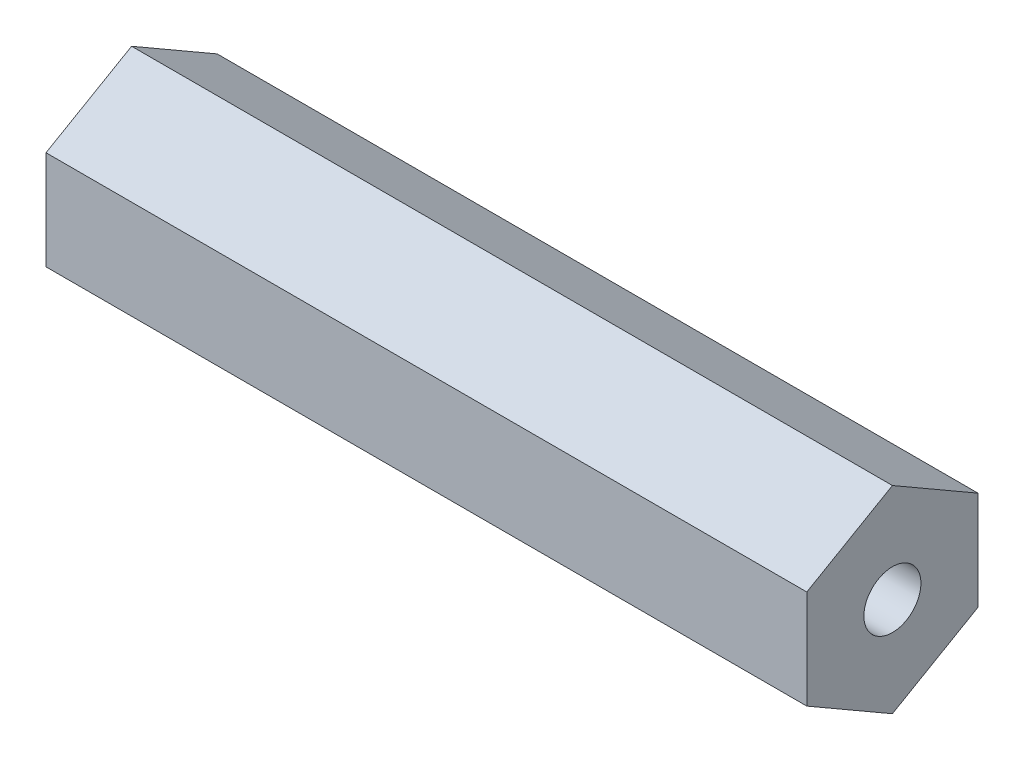
ISO-10303-21;
HEADER;
FILE_DESCRIPTION(('STEP AP214'),'2;1');
FILE_NAME('part.step','',(''),(''),'','','');
FILE_SCHEMA(('AUTOMOTIVE_DESIGN { 1 0 10303 214 1 1 1 1 }'));
ENDSEC;
DATA;
#1=APPLICATION_CONTEXT('core data for automotive mechanical design processes');
#2=APPLICATION_PROTOCOL_DEFINITION('international standard','automotive_design',2000,#1);
#3=PRODUCT_CONTEXT('',#1,'mechanical');
#4=PRODUCT('Part','Part','',(#3));
#5=PRODUCT_RELATED_PRODUCT_CATEGORY('part','',(#4));
#6=PRODUCT_DEFINITION_FORMATION('','',#4);
#7=PRODUCT_DEFINITION_CONTEXT('part definition',#1,'design');
#8=PRODUCT_DEFINITION('design','',#6,#7);
#9=PRODUCT_DEFINITION_SHAPE('','',#8);
#10=(LENGTH_UNIT() NAMED_UNIT(*) SI_UNIT(.MILLI.,.METRE.));
#11=(NAMED_UNIT(*) PLANE_ANGLE_UNIT() SI_UNIT($,.RADIAN.));
#12=(NAMED_UNIT(*) SI_UNIT($,.STERADIAN.) SOLID_ANGLE_UNIT());
#13=UNCERTAINTY_MEASURE_WITH_UNIT(LENGTH_MEASURE(1.E-05),#10,'distance_accuracy_value','');
#14=(GEOMETRIC_REPRESENTATION_CONTEXT(3) GLOBAL_UNCERTAINTY_ASSIGNED_CONTEXT((#13)) GLOBAL_UNIT_ASSIGNED_CONTEXT((#10,
#11,#12)) REPRESENTATION_CONTEXT('',''));
#15=CARTESIAN_POINT('',(0.,0.,0.));
#16=DIRECTION('',(0.,0.,1.));
#17=DIRECTION('',(1.,0.,0.));
#18=AXIS2_PLACEMENT_3D('',#15,#16,#17);
#19=CARTESIAN_POINT('',(-10.,32.,73.));
#20=DIRECTION('',(-1.,0.,0.));
#21=DIRECTION('',(0.,0.,1.));
#22=AXIS2_PLACEMENT_3D('',#19,#20,#21);
#23=CYLINDRICAL_SURFACE('',#22,0.749999999999987);
#24=CARTESIAN_POINT('',(10.,32.,73.));
#25=DIRECTION('',(-1.,0.,0.));
#26=DIRECTION('',(0.,0.,1.));
#27=AXIS2_PLACEMENT_3D('',#24,#25,#26);
#28=CIRCLE('',#27,0.749999999999985);
#29=CARTESIAN_POINT('',(10.,32.,73.75));
#30=VERTEX_POINT('',#29);
#31=EDGE_CURVE('E11',#30,#30,#28,.T.);
#32=ORIENTED_EDGE('',*,*,#31,.F.);
#33=EDGE_LOOP('',(#32));
#34=FACE_BOUND('',#33,.T.);
#35=CARTESIAN_POINT('',(-10.,32.,73.));
#36=DIRECTION('',(-1.,0.,0.));
#37=DIRECTION('',(0.,0.,1.));
#38=AXIS2_PLACEMENT_3D('',#35,#36,#37);
#39=CIRCLE('',#38,0.749999999999989);
#40=CARTESIAN_POINT('',(-10.,32.,73.75));
#41=VERTEX_POINT('',#40);
#42=EDGE_CURVE('E47',#41,#41,#39,.T.);
#43=ORIENTED_EDGE('',*,*,#42,.T.);
#44=EDGE_LOOP('',(#43));
#45=FACE_BOUND('',#44,.T.);
#46=ADVANCED_FACE('F36',(#34,#45),#23,.F.);
#47=CARTESIAN_POINT('',(10.,32.,73.));
#48=DIRECTION('',(-1.,0.,0.));
#49=DIRECTION('',(0.,0.,1.));
#50=AXIS2_PLACEMENT_3D('',#47,#48,#49);
#51=PLANE('',#50);
#52=ORIENTED_EDGE('',*,*,#31,.T.);
#53=EDGE_LOOP('',(#52));
#54=FACE_BOUND('',#53,.T.);
#55=DIRECTION('',(0.,-1.,0.));
#56=VECTOR('',#55,1.);
#57=CARTESIAN_POINT('',(10.,33.2990381056767,70.75));
#58=LINE('',#57,#56);
#59=CARTESIAN_POINT('',(10.,33.2990381056767,70.75));
#60=VERTEX_POINT('',#59);
#61=CARTESIAN_POINT('',(10.,30.7009618943233,70.75));
#62=VERTEX_POINT('',#61);
#63=EDGE_CURVE('E152',#60,#62,#58,.T.);
#64=ORIENTED_EDGE('',*,*,#63,.F.);
#65=DIRECTION('',(0.,-0.5,-0.866025403784439));
#66=VECTOR('',#65,1.);
#67=CARTESIAN_POINT('',(10.,34.5980762113533,73.));
#68=LINE('',#67,#66);
#69=CARTESIAN_POINT('',(10.,34.5980762113533,73.));
#70=VERTEX_POINT('',#69);
#71=EDGE_CURVE('E131',#70,#60,#68,.T.);
#72=ORIENTED_EDGE('',*,*,#71,.F.);
#73=DIRECTION('',(0.,0.5,-0.866025403784439));
#74=VECTOR('',#73,1.);
#75=CARTESIAN_POINT('',(10.,33.2990381056767,75.25));
#76=LINE('',#75,#74);
#77=CARTESIAN_POINT('',(10.,33.2990381056767,75.25));
#78=VERTEX_POINT('',#77);
#79=EDGE_CURVE('E167',#78,#70,#76,.T.);
#80=ORIENTED_EDGE('',*,*,#79,.F.);
#81=DIRECTION('',(0.,1.,0.));
#82=VECTOR('',#81,1.);
#83=CARTESIAN_POINT('',(10.,30.7009618943233,75.25));
#84=LINE('',#83,#82);
#85=CARTESIAN_POINT('',(10.,30.7009618943233,75.25));
#86=VERTEX_POINT('',#85);
#87=EDGE_CURVE('E110',#86,#78,#84,.T.);
#88=ORIENTED_EDGE('',*,*,#87,.F.);
#89=DIRECTION('',(0.,0.5,0.866025403784439));
#90=VECTOR('',#89,1.);
#91=CARTESIAN_POINT('',(10.,29.4019237886467,73.));
#92=LINE('',#91,#90);
#93=CARTESIAN_POINT('',(10.,29.4019237886467,73.));
#94=VERTEX_POINT('',#93);
#95=EDGE_CURVE('E162',#94,#86,#92,.T.);
#96=ORIENTED_EDGE('',*,*,#95,.F.);
#97=DIRECTION('',(0.,-0.5,0.866025403784439));
#98=VECTOR('',#97,1.);
#99=CARTESIAN_POINT('',(10.,30.7009618943233,70.75));
#100=LINE('',#99,#98);
#101=EDGE_CURVE('E141',#62,#94,#100,.T.);
#102=ORIENTED_EDGE('',*,*,#101,.F.);
#103=EDGE_LOOP('',(#64,#72,#80,#88,#96,#102));
#104=FACE_BOUND('',#103,.T.);
#105=ADVANCED_FACE('F207',(#54,#104),#51,.F.);
#106=CARTESIAN_POINT('',(-10.,32.,73.));
#107=DIRECTION('',(-1.,0.,0.));
#108=DIRECTION('',(0.,0.,1.));
#109=AXIS2_PLACEMENT_3D('',#106,#107,#108);
#110=PLANE('',#109);
#111=ORIENTED_EDGE('',*,*,#42,.F.);
#112=EDGE_LOOP('',(#111));
#113=FACE_BOUND('',#112,.T.);
#114=DIRECTION('',(0.,-1.,0.));
#115=VECTOR('',#114,1.);
#116=CARTESIAN_POINT('',(-10.,33.2990381056767,70.75));
#117=LINE('',#116,#115);
#118=CARTESIAN_POINT('',(-10.,33.2990381056767,70.75));
#119=VERTEX_POINT('',#118);
#120=CARTESIAN_POINT('',(-10.,30.7009618943233,70.75));
#121=VERTEX_POINT('',#120);
#122=EDGE_CURVE('E123',#119,#121,#117,.T.);
#123=ORIENTED_EDGE('',*,*,#122,.T.);
#124=DIRECTION('',(0.,-0.5,0.866025403784439));
#125=VECTOR('',#124,1.);
#126=CARTESIAN_POINT('',(-10.,30.7009618943233,70.75));
#127=LINE('',#126,#125);
#128=CARTESIAN_POINT('',(-10.,29.4019237886467,73.));
#129=VERTEX_POINT('',#128);
#130=EDGE_CURVE('E159',#121,#129,#127,.T.);
#131=ORIENTED_EDGE('',*,*,#130,.T.);
#132=DIRECTION('',(0.,0.5,0.866025403784439));
#133=VECTOR('',#132,1.);
#134=CARTESIAN_POINT('',(-10.,29.4019237886467,73.));
#135=LINE('',#134,#133);
#136=CARTESIAN_POINT('',(-10.,30.7009618943233,75.25));
#137=VERTEX_POINT('',#136);
#138=EDGE_CURVE('E102',#129,#137,#135,.T.);
#139=ORIENTED_EDGE('',*,*,#138,.T.);
#140=DIRECTION('',(0.,1.,0.));
#141=VECTOR('',#140,1.);
#142=CARTESIAN_POINT('',(-10.,30.7009618943233,75.25));
#143=LINE('',#142,#141);
#144=CARTESIAN_POINT('',(-10.,33.2990381056767,75.25));
#145=VERTEX_POINT('',#144);
#146=EDGE_CURVE('E164',#137,#145,#143,.T.);
#147=ORIENTED_EDGE('',*,*,#146,.T.);
#148=DIRECTION('',(0.,0.5,-0.866025403784439));
#149=VECTOR('',#148,1.);
#150=CARTESIAN_POINT('',(-10.,33.2990381056767,75.25));
#151=LINE('',#150,#149);
#152=CARTESIAN_POINT('',(-10.,34.5980762113533,73.));
#153=VERTEX_POINT('',#152);
#154=EDGE_CURVE('E126',#145,#153,#151,.T.);
#155=ORIENTED_EDGE('',*,*,#154,.T.);
#156=DIRECTION('',(0.,-0.5,-0.866025403784439));
#157=VECTOR('',#156,1.);
#158=CARTESIAN_POINT('',(-10.,34.5980762113533,73.));
#159=LINE('',#158,#157);
#160=EDGE_CURVE('E119',#153,#119,#159,.T.);
#161=ORIENTED_EDGE('',*,*,#160,.T.);
#162=EDGE_LOOP('',(#123,#131,#139,#147,#155,#161));
#163=FACE_BOUND('',#162,.T.);
#164=ADVANCED_FACE('F121',(#113,#163),#110,.T.);
#165=CARTESIAN_POINT('',(-10.,34.5980762113533,73.));
#166=DIRECTION('',(0.,-0.866025403784439,0.5));
#167=DIRECTION('',(1.,0.,0.));
#168=AXIS2_PLACEMENT_3D('',#165,#166,#167);
#169=PLANE('',#168);
#170=ORIENTED_EDGE('',*,*,#71,.T.);
#171=DIRECTION('',(1.,0.,0.));
#172=VECTOR('',#171,1.);
#173=CARTESIAN_POINT('',(-10.,33.2990381056767,70.75));
#174=LINE('',#173,#172);
#175=EDGE_CURVE('E135',#119,#60,#174,.T.);
#176=ORIENTED_EDGE('',*,*,#175,.F.);
#177=ORIENTED_EDGE('',*,*,#160,.F.);
#178=DIRECTION('',(1.,0.,0.));
#179=VECTOR('',#178,1.);
#180=CARTESIAN_POINT('',(-10.,34.5980762113533,73.));
#181=LINE('',#180,#179);
#182=EDGE_CURVE('E171',#153,#70,#181,.T.);
#183=ORIENTED_EDGE('',*,*,#182,.T.);
#184=EDGE_LOOP('',(#170,#176,#177,#183));
#185=FACE_BOUND('',#184,.T.);
#186=ADVANCED_FACE('F136',(#185),#169,.F.);
#187=CARTESIAN_POINT('',(-10.,33.2990381056767,75.25));
#188=DIRECTION('',(0.,-0.866025403784439,-0.5));
#189=DIRECTION('',(0.,0.5,-0.866025403784439));
#190=AXIS2_PLACEMENT_3D('',#187,#188,#189);
#191=PLANE('',#190);
#192=ORIENTED_EDGE('',*,*,#79,.T.);
#193=ORIENTED_EDGE('',*,*,#182,.F.);
#194=ORIENTED_EDGE('',*,*,#154,.F.);
#195=DIRECTION('',(1.,0.,0.));
#196=VECTOR('',#195,1.);
#197=CARTESIAN_POINT('',(-10.,33.2990381056767,75.25));
#198=LINE('',#197,#196);
#199=EDGE_CURVE('E40',#145,#78,#198,.T.);
#200=ORIENTED_EDGE('',*,*,#199,.T.);
#201=EDGE_LOOP('',(#192,#193,#194,#200));
#202=FACE_BOUND('',#201,.T.);
#203=ADVANCED_FACE('F38',(#202),#191,.F.);
#204=CARTESIAN_POINT('',(-10.,30.7009618943233,75.25));
#205=DIRECTION('',(0.,0.,-1.));
#206=DIRECTION('',(0.,1.,0.));
#207=AXIS2_PLACEMENT_3D('',#204,#205,#206);
#208=PLANE('',#207);
#209=ORIENTED_EDGE('',*,*,#87,.T.);
#210=ORIENTED_EDGE('',*,*,#199,.F.);
#211=ORIENTED_EDGE('',*,*,#146,.F.);
#212=DIRECTION('',(1.,0.,0.));
#213=VECTOR('',#212,1.);
#214=CARTESIAN_POINT('',(-10.,30.7009618943233,75.25));
#215=LINE('',#214,#213);
#216=EDGE_CURVE('E160',#137,#86,#215,.T.);
#217=ORIENTED_EDGE('',*,*,#216,.T.);
#218=EDGE_LOOP('',(#209,#210,#211,#217));
#219=FACE_BOUND('',#218,.T.);
#220=ADVANCED_FACE('F199',(#219),#208,.F.);
#221=CARTESIAN_POINT('',(-10.,29.4019237886467,73.));
#222=DIRECTION('',(0.,0.866025403784439,-0.5));
#223=DIRECTION('',(-1.,0.,0.));
#224=AXIS2_PLACEMENT_3D('',#221,#222,#223);
#225=PLANE('',#224);
#226=ORIENTED_EDGE('',*,*,#95,.T.);
#227=ORIENTED_EDGE('',*,*,#216,.F.);
#228=ORIENTED_EDGE('',*,*,#138,.F.);
#229=DIRECTION('',(1.,0.,0.));
#230=VECTOR('',#229,1.);
#231=CARTESIAN_POINT('',(-10.,29.4019237886467,73.));
#232=LINE('',#231,#230);
#233=EDGE_CURVE('E157',#129,#94,#232,.T.);
#234=ORIENTED_EDGE('',*,*,#233,.T.);
#235=EDGE_LOOP('',(#226,#227,#228,#234));
#236=FACE_BOUND('',#235,.T.);
#237=ADVANCED_FACE('F201',(#236),#225,.F.);
#238=CARTESIAN_POINT('',(-10.,30.7009618943233,70.75));
#239=DIRECTION('',(0.,0.866025403784439,0.5));
#240=DIRECTION('',(1.,0.,0.));
#241=AXIS2_PLACEMENT_3D('',#238,#239,#240);
#242=PLANE('',#241);
#243=ORIENTED_EDGE('',*,*,#101,.T.);
#244=ORIENTED_EDGE('',*,*,#233,.F.);
#245=ORIENTED_EDGE('',*,*,#130,.F.);
#246=DIRECTION('',(1.,0.,0.));
#247=VECTOR('',#246,1.);
#248=CARTESIAN_POINT('',(-10.,30.7009618943233,70.75));
#249=LINE('',#248,#247);
#250=EDGE_CURVE('E145',#121,#62,#249,.T.);
#251=ORIENTED_EDGE('',*,*,#250,.T.);
#252=EDGE_LOOP('',(#243,#244,#245,#251));
#253=FACE_BOUND('',#252,.T.);
#254=ADVANCED_FACE('F209',(#253),#242,.F.);
#255=CARTESIAN_POINT('',(-10.,33.2990381056767,70.75));
#256=DIRECTION('',(0.,0.,1.));
#257=DIRECTION('',(0.,-1.,0.));
#258=AXIS2_PLACEMENT_3D('',#255,#256,#257);
#259=PLANE('',#258);
#260=ORIENTED_EDGE('',*,*,#63,.T.);
#261=ORIENTED_EDGE('',*,*,#250,.F.);
#262=ORIENTED_EDGE('',*,*,#122,.F.);
#263=ORIENTED_EDGE('',*,*,#175,.T.);
#264=EDGE_LOOP('',(#260,#261,#262,#263));
#265=FACE_BOUND('',#264,.T.);
#266=ADVANCED_FACE('F143',(#265),#259,.F.);
#267=CLOSED_SHELL('',(#46,#105,#164,#186,#203,#220,#237,#254,#266));
#268=MANIFOLD_SOLID_BREP('B2',#267);
#269=ADVANCED_BREP_SHAPE_REPRESENTATION('',(#18,#268),#14);
#270=SHAPE_DEFINITION_REPRESENTATION(#9,#269);
ENDSEC;
END-ISO-10303-21;
